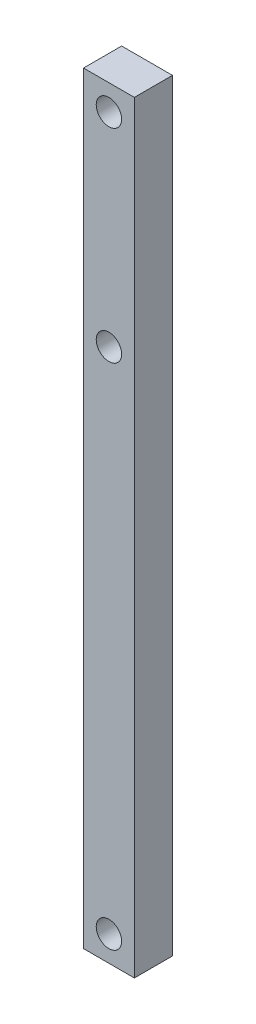
ISO-10303-21;
HEADER;
FILE_DESCRIPTION(('STEP AP214'),'2;1');
FILE_NAME('part.step','',(''),(''),'','','');
FILE_SCHEMA(('AUTOMOTIVE_DESIGN { 1 0 10303 214 1 1 1 1 }'));
ENDSEC;
DATA;
#1=APPLICATION_CONTEXT('core data for automotive mechanical design processes');
#2=APPLICATION_PROTOCOL_DEFINITION('international standard','automotive_design',2000,#1);
#3=PRODUCT_CONTEXT('',#1,'mechanical');
#4=PRODUCT('Part','Part','',(#3));
#5=PRODUCT_RELATED_PRODUCT_CATEGORY('part','',(#4));
#6=PRODUCT_DEFINITION_FORMATION('','',#4);
#7=PRODUCT_DEFINITION_CONTEXT('part definition',#1,'design');
#8=PRODUCT_DEFINITION('design','',#6,#7);
#9=PRODUCT_DEFINITION_SHAPE('','',#8);
#10=(LENGTH_UNIT() NAMED_UNIT(*) SI_UNIT(.MILLI.,.METRE.));
#11=(NAMED_UNIT(*) PLANE_ANGLE_UNIT() SI_UNIT($,.RADIAN.));
#12=(NAMED_UNIT(*) SI_UNIT($,.STERADIAN.) SOLID_ANGLE_UNIT());
#13=UNCERTAINTY_MEASURE_WITH_UNIT(LENGTH_MEASURE(1.E-05),#10,'distance_accuracy_value','');
#14=(GEOMETRIC_REPRESENTATION_CONTEXT(3) GLOBAL_UNCERTAINTY_ASSIGNED_CONTEXT((#13)) GLOBAL_UNIT_ASSIGNED_CONTEXT((#10,
#11,#12)) REPRESENTATION_CONTEXT('',''));
#15=CARTESIAN_POINT('',(0.,0.,0.));
#16=DIRECTION('',(0.,0.,1.));
#17=DIRECTION('',(1.,0.,0.));
#18=AXIS2_PLACEMENT_3D('',#15,#16,#17);
#19=CARTESIAN_POINT('',(-10.,150.,15.));
#20=DIRECTION('',(0.,1.,0.));
#21=DIRECTION('',(0.,0.,1.));
#22=AXIS2_PLACEMENT_3D('',#19,#20,#21);
#23=PLANE('',#22);
#24=DIRECTION('',(1.,0.,0.));
#25=VECTOR('',#24,1.);
#26=CARTESIAN_POINT('',(-10.,150.,0.));
#27=LINE('',#26,#25);
#28=CARTESIAN_POINT('',(-10.,150.,0.));
#29=VERTEX_POINT('',#28);
#30=CARTESIAN_POINT('',(9.99999999999997,150.,0.));
#31=VERTEX_POINT('',#30);
#32=EDGE_CURVE('E111',#29,#31,#27,.T.);
#33=ORIENTED_EDGE('',*,*,#32,.F.);
#34=DIRECTION('',(0.,0.,-1.));
#35=VECTOR('',#34,1.);
#36=CARTESIAN_POINT('',(-10.,150.,15.));
#37=LINE('',#36,#35);
#38=CARTESIAN_POINT('',(-10.,150.,15.));
#39=VERTEX_POINT('',#38);
#40=EDGE_CURVE('E11',#39,#29,#37,.T.);
#41=ORIENTED_EDGE('',*,*,#40,.F.);
#42=DIRECTION('',(1.,0.,0.));
#43=VECTOR('',#42,1.);
#44=CARTESIAN_POINT('',(-10.,150.,15.));
#45=LINE('',#44,#43);
#46=CARTESIAN_POINT('',(9.99999999999997,150.,15.));
#47=VERTEX_POINT('',#46);
#48=EDGE_CURVE('E103',#39,#47,#45,.T.);
#49=ORIENTED_EDGE('',*,*,#48,.T.);
#50=DIRECTION('',(0.,0.,-1.));
#51=VECTOR('',#50,1.);
#52=CARTESIAN_POINT('',(9.99999999999997,150.,15.));
#53=LINE('',#52,#51);
#54=EDGE_CURVE('E42',#47,#31,#53,.T.);
#55=ORIENTED_EDGE('',*,*,#54,.T.);
#56=EDGE_LOOP('',(#33,#41,#49,#55));
#57=FACE_BOUND('',#56,.T.);
#58=ADVANCED_FACE('F39',(#57),#23,.T.);
#59=CARTESIAN_POINT('',(-10.,150.,15.));
#60=DIRECTION('',(1.,0.,0.));
#61=DIRECTION('',(0.,1.,0.));
#62=AXIS2_PLACEMENT_3D('',#59,#60,#61);
#63=PLANE('',#62);
#64=DIRECTION('',(0.,-1.,0.));
#65=VECTOR('',#64,1.);
#66=CARTESIAN_POINT('',(-10.,150.,0.));
#67=LINE('',#66,#65);
#68=CARTESIAN_POINT('',(-9.99999999999999,-150.,0.));
#69=VERTEX_POINT('',#68);
#70=EDGE_CURVE('E73',#29,#69,#67,.T.);
#71=ORIENTED_EDGE('',*,*,#70,.T.);
#72=DIRECTION('',(0.,0.,-1.));
#73=VECTOR('',#72,1.);
#74=CARTESIAN_POINT('',(-9.99999999999999,-150.,15.));
#75=LINE('',#74,#73);
#76=CARTESIAN_POINT('',(-9.99999999999999,-150.,15.));
#77=VERTEX_POINT('',#76);
#78=EDGE_CURVE('E49',#77,#69,#75,.T.);
#79=ORIENTED_EDGE('',*,*,#78,.F.);
#80=DIRECTION('',(0.,-1.,0.));
#81=VECTOR('',#80,1.);
#82=CARTESIAN_POINT('',(-10.,150.,15.));
#83=LINE('',#82,#81);
#84=EDGE_CURVE('E90',#39,#77,#83,.T.);
#85=ORIENTED_EDGE('',*,*,#84,.F.);
#86=ORIENTED_EDGE('',*,*,#40,.T.);
#87=EDGE_LOOP('',(#71,#79,#85,#86));
#88=FACE_BOUND('',#87,.T.);
#89=ADVANCED_FACE('F128',(#88),#63,.F.);
#90=CARTESIAN_POINT('',(-9.99999999999999,-150.,15.));
#91=DIRECTION('',(0.,1.,0.));
#92=DIRECTION('',(0.,0.,1.));
#93=AXIS2_PLACEMENT_3D('',#90,#91,#92);
#94=PLANE('',#93);
#95=DIRECTION('',(1.,0.,0.));
#96=VECTOR('',#95,1.);
#97=CARTESIAN_POINT('',(-9.99999999999999,-150.,0.));
#98=LINE('',#97,#96);
#99=CARTESIAN_POINT('',(10.,-150.,0.));
#100=VERTEX_POINT('',#99);
#101=EDGE_CURVE('E98',#69,#100,#98,.T.);
#102=ORIENTED_EDGE('',*,*,#101,.T.);
#103=DIRECTION('',(0.,0.,-1.));
#104=VECTOR('',#103,1.);
#105=CARTESIAN_POINT('',(10.,-150.,15.));
#106=LINE('',#105,#104);
#107=CARTESIAN_POINT('',(10.,-150.,15.));
#108=VERTEX_POINT('',#107);
#109=EDGE_CURVE('E95',#108,#100,#106,.T.);
#110=ORIENTED_EDGE('',*,*,#109,.F.);
#111=DIRECTION('',(1.,0.,0.));
#112=VECTOR('',#111,1.);
#113=CARTESIAN_POINT('',(-9.99999999999999,-150.,15.));
#114=LINE('',#113,#112);
#115=EDGE_CURVE('E85',#77,#108,#114,.T.);
#116=ORIENTED_EDGE('',*,*,#115,.F.);
#117=ORIENTED_EDGE('',*,*,#78,.T.);
#118=EDGE_LOOP('',(#102,#110,#116,#117));
#119=FACE_BOUND('',#118,.T.);
#120=ADVANCED_FACE('F96',(#119),#94,.F.);
#121=CARTESIAN_POINT('',(9.99999999999997,150.,15.));
#122=DIRECTION('',(1.,0.,0.));
#123=DIRECTION('',(0.,1.,0.));
#124=AXIS2_PLACEMENT_3D('',#121,#122,#123);
#125=PLANE('',#124);
#126=DIRECTION('',(0.,-1.,0.));
#127=VECTOR('',#126,1.);
#128=CARTESIAN_POINT('',(9.99999999999997,150.,0.));
#129=LINE('',#128,#127);
#130=EDGE_CURVE('E115',#31,#100,#129,.T.);
#131=ORIENTED_EDGE('',*,*,#130,.F.);
#132=ORIENTED_EDGE('',*,*,#54,.F.);
#133=DIRECTION('',(0.,-1.,0.));
#134=VECTOR('',#133,1.);
#135=CARTESIAN_POINT('',(9.99999999999997,150.,15.));
#136=LINE('',#135,#134);
#137=EDGE_CURVE('E89',#47,#108,#136,.T.);
#138=ORIENTED_EDGE('',*,*,#137,.T.);
#139=ORIENTED_EDGE('',*,*,#109,.T.);
#140=EDGE_LOOP('',(#131,#132,#138,#139));
#141=FACE_BOUND('',#140,.T.);
#142=ADVANCED_FACE('F101',(#141),#125,.T.);
#143=CARTESIAN_POINT('',(0.,0.,15.));
#144=DIRECTION('',(0.,0.,-1.));
#145=DIRECTION('',(-1.,0.,0.));
#146=AXIS2_PLACEMENT_3D('',#143,#144,#145);
#147=PLANE('',#146);
#148=CARTESIAN_POINT('',(0.,-140.,15.));
#149=DIRECTION('',(0.,0.,-1.));
#150=DIRECTION('',(-1.,0.,0.));
#151=AXIS2_PLACEMENT_3D('',#148,#149,#150);
#152=CIRCLE('',#151,5.);
#153=CARTESIAN_POINT('',(-5.,-140.,15.));
#154=VERTEX_POINT('',#153);
#155=EDGE_CURVE('E116',#154,#154,#152,.T.);
#156=ORIENTED_EDGE('',*,*,#155,.T.);
#157=EDGE_LOOP('',(#156));
#158=FACE_BOUND('',#157,.T.);
#159=CARTESIAN_POINT('',(0.,140.,15.));
#160=DIRECTION('',(0.,0.,-1.));
#161=DIRECTION('',(-1.,0.,0.));
#162=AXIS2_PLACEMENT_3D('',#159,#160,#161);
#163=CIRCLE('',#162,5.);
#164=CARTESIAN_POINT('',(-5.,140.,15.));
#165=VERTEX_POINT('',#164);
#166=EDGE_CURVE('E170',#165,#165,#163,.T.);
#167=ORIENTED_EDGE('',*,*,#166,.T.);
#168=EDGE_LOOP('',(#167));
#169=FACE_BOUND('',#168,.T.);
#170=CARTESIAN_POINT('',(0.,59.9999999999999,15.));
#171=DIRECTION('',(0.,0.,-1.));
#172=DIRECTION('',(-1.,0.,0.));
#173=AXIS2_PLACEMENT_3D('',#170,#171,#172);
#174=CIRCLE('',#173,5.);
#175=CARTESIAN_POINT('',(-5.,59.9999999999999,15.));
#176=VERTEX_POINT('',#175);
#177=EDGE_CURVE('E182',#176,#176,#174,.T.);
#178=ORIENTED_EDGE('',*,*,#177,.T.);
#179=EDGE_LOOP('',(#178));
#180=FACE_BOUND('',#179,.T.);
#181=ORIENTED_EDGE('',*,*,#48,.F.);
#182=ORIENTED_EDGE('',*,*,#84,.T.);
#183=ORIENTED_EDGE('',*,*,#115,.T.);
#184=ORIENTED_EDGE('',*,*,#137,.F.);
#185=EDGE_LOOP('',(#181,#182,#183,#184));
#186=FACE_BOUND('',#185,.T.);
#187=ADVANCED_FACE('F88',(#158,#169,#180,#186),#147,.F.);
#188=CARTESIAN_POINT('',(0.,0.,0.));
#189=DIRECTION('',(0.,0.,-1.));
#190=DIRECTION('',(-1.,0.,0.));
#191=AXIS2_PLACEMENT_3D('',#188,#189,#190);
#192=PLANE('',#191);
#193=CARTESIAN_POINT('',(0.,-140.,0.));
#194=DIRECTION('',(0.,0.,-1.));
#195=DIRECTION('',(-1.,0.,0.));
#196=AXIS2_PLACEMENT_3D('',#193,#194,#195);
#197=CIRCLE('',#196,5.);
#198=CARTESIAN_POINT('',(-5.,-140.,0.));
#199=VERTEX_POINT('',#198);
#200=EDGE_CURVE('E168',#199,#199,#197,.T.);
#201=ORIENTED_EDGE('',*,*,#200,.F.);
#202=EDGE_LOOP('',(#201));
#203=FACE_BOUND('',#202,.T.);
#204=CARTESIAN_POINT('',(0.,140.,0.));
#205=DIRECTION('',(0.,0.,-1.));
#206=DIRECTION('',(-1.,0.,0.));
#207=AXIS2_PLACEMENT_3D('',#204,#205,#206);
#208=CIRCLE('',#207,5.);
#209=CARTESIAN_POINT('',(-5.,140.,0.));
#210=VERTEX_POINT('',#209);
#211=EDGE_CURVE('E176',#210,#210,#208,.T.);
#212=ORIENTED_EDGE('',*,*,#211,.F.);
#213=EDGE_LOOP('',(#212));
#214=FACE_BOUND('',#213,.T.);
#215=CARTESIAN_POINT('',(0.,59.9999999999999,0.));
#216=DIRECTION('',(0.,0.,-1.));
#217=DIRECTION('',(-1.,0.,0.));
#218=AXIS2_PLACEMENT_3D('',#215,#216,#217);
#219=CIRCLE('',#218,5.);
#220=CARTESIAN_POINT('',(-5.,59.9999999999999,0.));
#221=VERTEX_POINT('',#220);
#222=EDGE_CURVE('E185',#221,#221,#219,.T.);
#223=ORIENTED_EDGE('',*,*,#222,.F.);
#224=EDGE_LOOP('',(#223));
#225=FACE_BOUND('',#224,.T.);
#226=ORIENTED_EDGE('',*,*,#32,.T.);
#227=ORIENTED_EDGE('',*,*,#130,.T.);
#228=ORIENTED_EDGE('',*,*,#101,.F.);
#229=ORIENTED_EDGE('',*,*,#70,.F.);
#230=EDGE_LOOP('',(#226,#227,#228,#229));
#231=FACE_BOUND('',#230,.T.);
#232=ADVANCED_FACE('F125',(#203,#214,#225,#231),#192,.T.);
#233=CARTESIAN_POINT('',(0.,59.9999999999999,15.));
#234=DIRECTION('',(0.,0.,-1.));
#235=DIRECTION('',(-1.,0.,0.));
#236=AXIS2_PLACEMENT_3D('',#233,#234,#235);
#237=CYLINDRICAL_SURFACE('',#236,5.);
#238=ORIENTED_EDGE('',*,*,#177,.F.);
#239=EDGE_LOOP('',(#238));
#240=FACE_BOUND('',#239,.T.);
#241=ORIENTED_EDGE('',*,*,#222,.T.);
#242=EDGE_LOOP('',(#241));
#243=FACE_BOUND('',#242,.T.);
#244=ADVANCED_FACE('F147',(#240,#243),#237,.F.);
#245=CARTESIAN_POINT('',(0.,140.,15.));
#246=DIRECTION('',(0.,0.,-1.));
#247=DIRECTION('',(-1.,0.,0.));
#248=AXIS2_PLACEMENT_3D('',#245,#246,#247);
#249=CYLINDRICAL_SURFACE('',#248,5.);
#250=ORIENTED_EDGE('',*,*,#166,.F.);
#251=EDGE_LOOP('',(#250));
#252=FACE_BOUND('',#251,.T.);
#253=ORIENTED_EDGE('',*,*,#211,.T.);
#254=EDGE_LOOP('',(#253));
#255=FACE_BOUND('',#254,.T.);
#256=ADVANCED_FACE('F154',(#252,#255),#249,.F.);
#257=CARTESIAN_POINT('',(0.,-140.,15.));
#258=DIRECTION('',(0.,0.,-1.));
#259=DIRECTION('',(-1.,0.,0.));
#260=AXIS2_PLACEMENT_3D('',#257,#258,#259);
#261=CYLINDRICAL_SURFACE('',#260,5.);
#262=ORIENTED_EDGE('',*,*,#155,.F.);
#263=EDGE_LOOP('',(#262));
#264=FACE_BOUND('',#263,.T.);
#265=ORIENTED_EDGE('',*,*,#200,.T.);
#266=EDGE_LOOP('',(#265));
#267=FACE_BOUND('',#266,.T.);
#268=ADVANCED_FACE('F158',(#264,#267),#261,.F.);
#269=CLOSED_SHELL('',(#58,#89,#120,#142,#187,#232,#244,#256,#268));
#270=MANIFOLD_SOLID_BREP('B2',#269);
#271=ADVANCED_BREP_SHAPE_REPRESENTATION('',(#18,#270),#14);
#272=SHAPE_DEFINITION_REPRESENTATION(#9,#271);
ENDSEC;
END-ISO-10303-21;
